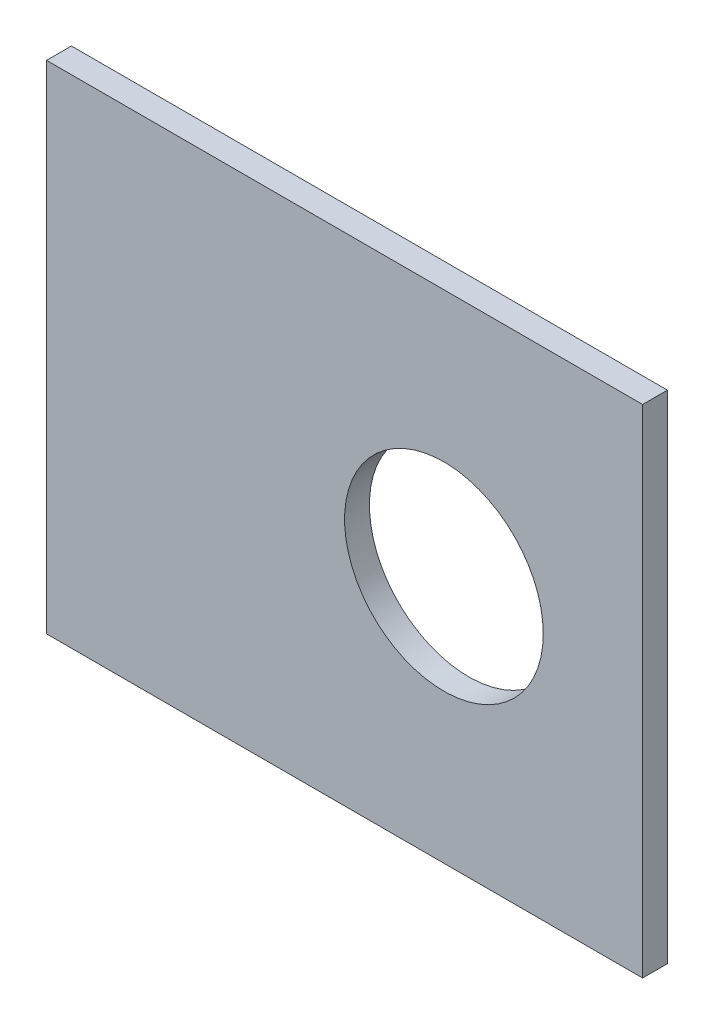
ISO-10303-21;
HEADER;
FILE_DESCRIPTION(('STEP AP214'),'2;1');
FILE_NAME('part.step','',(''),(''),'','','');
FILE_SCHEMA(('AUTOMOTIVE_DESIGN { 1 0 10303 214 1 1 1 1 }'));
ENDSEC;
DATA;
#1=APPLICATION_CONTEXT('core data for automotive mechanical design processes');
#2=APPLICATION_PROTOCOL_DEFINITION('international standard','automotive_design',2000,#1);
#3=PRODUCT_CONTEXT('',#1,'mechanical');
#4=PRODUCT('Part','Part','',(#3));
#5=PRODUCT_RELATED_PRODUCT_CATEGORY('part','',(#4));
#6=PRODUCT_DEFINITION_FORMATION('','',#4);
#7=PRODUCT_DEFINITION_CONTEXT('part definition',#1,'design');
#8=PRODUCT_DEFINITION('design','',#6,#7);
#9=PRODUCT_DEFINITION_SHAPE('','',#8);
#10=(LENGTH_UNIT() NAMED_UNIT(*) SI_UNIT(.MILLI.,.METRE.));
#11=(NAMED_UNIT(*) PLANE_ANGLE_UNIT() SI_UNIT($,.RADIAN.));
#12=(NAMED_UNIT(*) SI_UNIT($,.STERADIAN.) SOLID_ANGLE_UNIT());
#13=UNCERTAINTY_MEASURE_WITH_UNIT(LENGTH_MEASURE(1.E-05),#10,'distance_accuracy_value','');
#14=(GEOMETRIC_REPRESENTATION_CONTEXT(3) GLOBAL_UNCERTAINTY_ASSIGNED_CONTEXT((#13)) GLOBAL_UNIT_ASSIGNED_CONTEXT((#10,
#11,#12)) REPRESENTATION_CONTEXT('',''));
#15=CARTESIAN_POINT('',(0.,0.,0.));
#16=DIRECTION('',(0.,0.,1.));
#17=DIRECTION('',(1.,0.,0.));
#18=AXIS2_PLACEMENT_3D('',#15,#16,#17);
#19=CARTESIAN_POINT('',(0.,0.,3.175));
#20=DIRECTION('',(0.,0.,-1.));
#21=DIRECTION('',(-1.,0.,0.));
#22=AXIS2_PLACEMENT_3D('',#19,#20,#21);
#23=PLANE('',#22);
#24=DIRECTION('',(0.,-1.,0.));
#25=VECTOR('',#24,1.);
#26=CARTESIAN_POINT('',(0.,0.,3.175));
#27=LINE('',#26,#25);
#28=CARTESIAN_POINT('',(0.,63.5,3.175));
#29=VERTEX_POINT('',#28);
#30=CARTESIAN_POINT('',(0.,0.,3.175));
#31=VERTEX_POINT('',#30);
#32=EDGE_CURVE('E98',#29,#31,#27,.T.);
#33=ORIENTED_EDGE('',*,*,#32,.T.);
#34=DIRECTION('',(1.,0.,0.));
#35=VECTOR('',#34,1.);
#36=CARTESIAN_POINT('',(0.,0.,3.175));
#37=LINE('',#36,#35);
#38=CARTESIAN_POINT('',(76.2,0.,3.175));
#39=VERTEX_POINT('',#38);
#40=EDGE_CURVE('E93',#31,#39,#37,.T.);
#41=ORIENTED_EDGE('',*,*,#40,.T.);
#42=DIRECTION('',(0.,1.,0.));
#43=VECTOR('',#42,1.);
#44=CARTESIAN_POINT('',(76.2,0.,3.175));
#45=LINE('',#44,#43);
#46=CARTESIAN_POINT('',(76.2,63.5,3.175));
#47=VERTEX_POINT('',#46);
#48=EDGE_CURVE('E96',#39,#47,#45,.T.);
#49=ORIENTED_EDGE('',*,*,#48,.T.);
#50=DIRECTION('',(-1.,0.,0.));
#51=VECTOR('',#50,1.);
#52=CARTESIAN_POINT('',(0.,63.5,3.175));
#53=LINE('',#52,#51);
#54=EDGE_CURVE('E63',#47,#29,#53,.T.);
#55=ORIENTED_EDGE('',*,*,#54,.T.);
#56=EDGE_LOOP('',(#33,#41,#49,#55));
#57=FACE_BOUND('',#56,.T.);
#58=CARTESIAN_POINT('',(50.8,31.75,3.175));
#59=DIRECTION('',(0.,0.,1.));
#60=DIRECTION('',(1.,0.,0.));
#61=AXIS2_PLACEMENT_3D('',#58,#59,#60);
#62=CIRCLE('',#61,12.7);
#63=CARTESIAN_POINT('',(63.5,31.75,3.175));
#64=VERTEX_POINT('',#63);
#65=EDGE_CURVE('E118',#64,#64,#62,.T.);
#66=ORIENTED_EDGE('',*,*,#65,.F.);
#67=EDGE_LOOP('',(#66));
#68=FACE_BOUND('',#67,.T.);
#69=ADVANCED_FACE('F45',(#57,#68),#23,.F.);
#70=CARTESIAN_POINT('',(0.,0.,0.));
#71=DIRECTION('',(0.,0.,-1.));
#72=DIRECTION('',(-1.,0.,0.));
#73=AXIS2_PLACEMENT_3D('',#70,#71,#72);
#74=PLANE('',#73);
#75=DIRECTION('',(0.,-1.,0.));
#76=VECTOR('',#75,1.);
#77=CARTESIAN_POINT('',(0.,0.,0.));
#78=LINE('',#77,#76);
#79=CARTESIAN_POINT('',(0.,63.5,0.));
#80=VERTEX_POINT('',#79);
#81=CARTESIAN_POINT('',(0.,0.,0.));
#82=VERTEX_POINT('',#81);
#83=EDGE_CURVE('E114',#80,#82,#78,.T.);
#84=ORIENTED_EDGE('',*,*,#83,.F.);
#85=DIRECTION('',(-1.,0.,0.));
#86=VECTOR('',#85,1.);
#87=CARTESIAN_POINT('',(0.,63.5,0.));
#88=LINE('',#87,#86);
#89=CARTESIAN_POINT('',(76.2,63.5,0.));
#90=VERTEX_POINT('',#89);
#91=EDGE_CURVE('E86',#90,#80,#88,.T.);
#92=ORIENTED_EDGE('',*,*,#91,.F.);
#93=DIRECTION('',(0.,1.,0.));
#94=VECTOR('',#93,1.);
#95=CARTESIAN_POINT('',(76.2,0.,0.));
#96=LINE('',#95,#94);
#97=CARTESIAN_POINT('',(76.2,0.,0.));
#98=VERTEX_POINT('',#97);
#99=EDGE_CURVE('E80',#98,#90,#96,.T.);
#100=ORIENTED_EDGE('',*,*,#99,.F.);
#101=DIRECTION('',(1.,0.,0.));
#102=VECTOR('',#101,1.);
#103=CARTESIAN_POINT('',(0.,0.,0.));
#104=LINE('',#103,#102);
#105=EDGE_CURVE('E103',#82,#98,#104,.T.);
#106=ORIENTED_EDGE('',*,*,#105,.F.);
#107=EDGE_LOOP('',(#84,#92,#100,#106));
#108=FACE_BOUND('',#107,.T.);
#109=CARTESIAN_POINT('',(50.8,31.75,0.));
#110=DIRECTION('',(0.,0.,1.));
#111=DIRECTION('',(1.,0.,0.));
#112=AXIS2_PLACEMENT_3D('',#109,#110,#111);
#113=CIRCLE('',#112,12.7);
#114=CARTESIAN_POINT('',(63.5,31.75,0.));
#115=VERTEX_POINT('',#114);
#116=EDGE_CURVE('E136',#115,#115,#113,.T.);
#117=ORIENTED_EDGE('',*,*,#116,.T.);
#118=EDGE_LOOP('',(#117));
#119=FACE_BOUND('',#118,.T.);
#120=ADVANCED_FACE('F131',(#108,#119),#74,.T.);
#121=CARTESIAN_POINT('',(0.,0.,3.175));
#122=DIRECTION('',(1.,0.,0.));
#123=DIRECTION('',(0.,0.,-1.));
#124=AXIS2_PLACEMENT_3D('',#121,#122,#123);
#125=PLANE('',#124);
#126=ORIENTED_EDGE('',*,*,#83,.T.);
#127=DIRECTION('',(0.,0.,-1.));
#128=VECTOR('',#127,1.);
#129=CARTESIAN_POINT('',(0.,0.,3.175));
#130=LINE('',#129,#128);
#131=EDGE_CURVE('E11',#31,#82,#130,.T.);
#132=ORIENTED_EDGE('',*,*,#131,.F.);
#133=ORIENTED_EDGE('',*,*,#32,.F.);
#134=DIRECTION('',(0.,0.,-1.));
#135=VECTOR('',#134,1.);
#136=CARTESIAN_POINT('',(0.,63.5,3.175));
#137=LINE('',#136,#135);
#138=EDGE_CURVE('E110',#29,#80,#137,.T.);
#139=ORIENTED_EDGE('',*,*,#138,.T.);
#140=EDGE_LOOP('',(#126,#132,#133,#139));
#141=FACE_BOUND('',#140,.T.);
#142=ADVANCED_FACE('F47',(#141),#125,.F.);
#143=CARTESIAN_POINT('',(0.,0.,3.175));
#144=DIRECTION('',(0.,1.,0.));
#145=DIRECTION('',(0.,0.,1.));
#146=AXIS2_PLACEMENT_3D('',#143,#144,#145);
#147=PLANE('',#146);
#148=ORIENTED_EDGE('',*,*,#105,.T.);
#149=DIRECTION('',(0.,0.,-1.));
#150=VECTOR('',#149,1.);
#151=CARTESIAN_POINT('',(76.2,0.,3.175));
#152=LINE('',#151,#150);
#153=EDGE_CURVE('E55',#39,#98,#152,.T.);
#154=ORIENTED_EDGE('',*,*,#153,.F.);
#155=ORIENTED_EDGE('',*,*,#40,.F.);
#156=ORIENTED_EDGE('',*,*,#131,.T.);
#157=EDGE_LOOP('',(#148,#154,#155,#156));
#158=FACE_BOUND('',#157,.T.);
#159=ADVANCED_FACE('F102',(#158),#147,.F.);
#160=CARTESIAN_POINT('',(76.2,0.,3.175));
#161=DIRECTION('',(-1.,0.,0.));
#162=DIRECTION('',(0.,0.,1.));
#163=AXIS2_PLACEMENT_3D('',#160,#161,#162);
#164=PLANE('',#163);
#165=ORIENTED_EDGE('',*,*,#99,.T.);
#166=DIRECTION('',(0.,0.,-1.));
#167=VECTOR('',#166,1.);
#168=CARTESIAN_POINT('',(76.2,63.5,3.175));
#169=LINE('',#168,#167);
#170=EDGE_CURVE('E105',#47,#90,#169,.T.);
#171=ORIENTED_EDGE('',*,*,#170,.F.);
#172=ORIENTED_EDGE('',*,*,#48,.F.);
#173=ORIENTED_EDGE('',*,*,#153,.T.);
#174=EDGE_LOOP('',(#165,#171,#172,#173));
#175=FACE_BOUND('',#174,.T.);
#176=ADVANCED_FACE('F106',(#175),#164,.F.);
#177=CARTESIAN_POINT('',(0.,63.5,3.175));
#178=DIRECTION('',(0.,-1.,0.));
#179=DIRECTION('',(0.,0.,-1.));
#180=AXIS2_PLACEMENT_3D('',#177,#178,#179);
#181=PLANE('',#180);
#182=ORIENTED_EDGE('',*,*,#91,.T.);
#183=ORIENTED_EDGE('',*,*,#138,.F.);
#184=ORIENTED_EDGE('',*,*,#54,.F.);
#185=ORIENTED_EDGE('',*,*,#170,.T.);
#186=EDGE_LOOP('',(#182,#183,#184,#185));
#187=FACE_BOUND('',#186,.T.);
#188=ADVANCED_FACE('F128',(#187),#181,.F.);
#189=CARTESIAN_POINT('',(50.8,31.75,3.175));
#190=DIRECTION('',(0.,0.,-1.));
#191=DIRECTION('',(-1.,0.,0.));
#192=AXIS2_PLACEMENT_3D('',#189,#190,#191);
#193=CYLINDRICAL_SURFACE('',#192,12.7);
#194=ORIENTED_EDGE('',*,*,#65,.T.);
#195=EDGE_LOOP('',(#194));
#196=FACE_BOUND('',#195,.T.);
#197=ORIENTED_EDGE('',*,*,#116,.F.);
#198=EDGE_LOOP('',(#197));
#199=FACE_BOUND('',#198,.T.);
#200=ADVANCED_FACE('F144',(#196,#199),#193,.F.);
#201=CLOSED_SHELL('',(#69,#120,#142,#159,#176,#188,#200));
#202=MANIFOLD_SOLID_BREP('B2',#201);
#203=ADVANCED_BREP_SHAPE_REPRESENTATION('',(#18,#202),#14);
#204=SHAPE_DEFINITION_REPRESENTATION(#9,#203);
ENDSEC;
END-ISO-10303-21;
